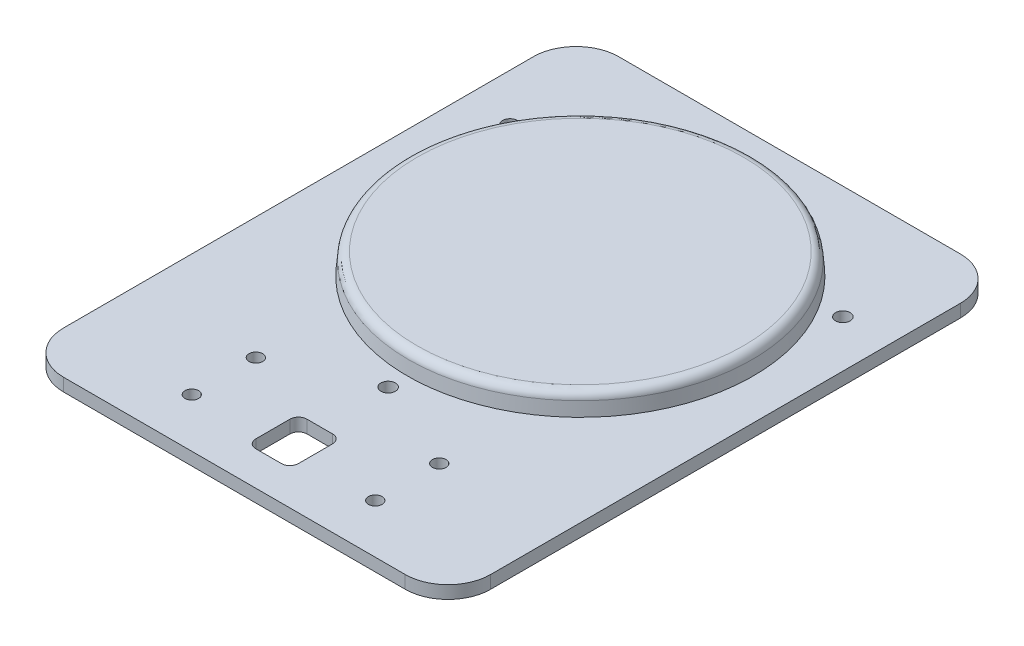
ISO-10303-21;
HEADER;
FILE_DESCRIPTION(('STEP AP214'),'2;1');
FILE_NAME('part.step','',(''),(''),'','','');
FILE_SCHEMA(('AUTOMOTIVE_DESIGN { 1 0 10303 214 1 1 1 1 }'));
ENDSEC;
DATA;
#1=APPLICATION_CONTEXT('core data for automotive mechanical design processes');
#2=APPLICATION_PROTOCOL_DEFINITION('international standard','automotive_design',2000,#1);
#3=PRODUCT_CONTEXT('',#1,'mechanical');
#4=PRODUCT('Part','Part','',(#3));
#5=PRODUCT_RELATED_PRODUCT_CATEGORY('part','',(#4));
#6=PRODUCT_DEFINITION_FORMATION('','',#4);
#7=PRODUCT_DEFINITION_CONTEXT('part definition',#1,'design');
#8=PRODUCT_DEFINITION('design','',#6,#7);
#9=PRODUCT_DEFINITION_SHAPE('','',#8);
#10=(LENGTH_UNIT() NAMED_UNIT(*) SI_UNIT(.MILLI.,.METRE.));
#11=(NAMED_UNIT(*) PLANE_ANGLE_UNIT() SI_UNIT($,.RADIAN.));
#12=(NAMED_UNIT(*) SI_UNIT($,.STERADIAN.) SOLID_ANGLE_UNIT());
#13=UNCERTAINTY_MEASURE_WITH_UNIT(LENGTH_MEASURE(1.E-05),#10,'distance_accuracy_value','');
#14=(GEOMETRIC_REPRESENTATION_CONTEXT(3) GLOBAL_UNCERTAINTY_ASSIGNED_CONTEXT((#13)) GLOBAL_UNIT_ASSIGNED_CONTEXT((#10,
#11,#12)) REPRESENTATION_CONTEXT('',''));
#15=CARTESIAN_POINT('',(0.,0.,0.));
#16=DIRECTION('',(0.,0.,1.));
#17=DIRECTION('',(1.,0.,0.));
#18=AXIS2_PLACEMENT_3D('',#15,#16,#17);
#19=CARTESIAN_POINT('',(-40.,-3.,-55.));
#20=DIRECTION('',(0.,1.,0.));
#21=DIRECTION('',(0.,0.,1.));
#22=AXIS2_PLACEMENT_3D('',#19,#20,#21);
#23=CYLINDRICAL_SURFACE('',#22,9.99999999999999);
#24=CARTESIAN_POINT('',(-40.,0.,-55.));
#25=DIRECTION('',(0.,1.,0.));
#26=DIRECTION('',(0.,0.,-1.));
#27=AXIS2_PLACEMENT_3D('',#24,#25,#26);
#28=CIRCLE('',#27,9.99999999999999);
#29=CARTESIAN_POINT('',(-39.9999999999999,0.,-65.));
#30=VERTEX_POINT('',#29);
#31=CARTESIAN_POINT('',(-50.,0.,-54.9999999999999));
#32=VERTEX_POINT('',#31);
#33=EDGE_CURVE('E257',#30,#32,#28,.T.);
#34=ORIENTED_EDGE('',*,*,#33,.F.);
#35=DIRECTION('',(0.,1.,0.));
#36=VECTOR('',#35,1.);
#37=CARTESIAN_POINT('',(-39.9999999999999,-3.,-65.));
#38=LINE('',#37,#36);
#39=CARTESIAN_POINT('',(-39.9999999999999,-3.,-65.));
#40=VERTEX_POINT('',#39);
#41=EDGE_CURVE('E308',#40,#30,#38,.T.);
#42=ORIENTED_EDGE('',*,*,#41,.F.);
#43=CARTESIAN_POINT('',(-40.,-3.,-55.));
#44=DIRECTION('',(0.,1.,0.));
#45=DIRECTION('',(0.,0.,-1.));
#46=AXIS2_PLACEMENT_3D('',#43,#44,#45);
#47=CIRCLE('',#46,9.99999999999999);
#48=CARTESIAN_POINT('',(-50.,-3.,-54.9999999999999));
#49=VERTEX_POINT('',#48);
#50=EDGE_CURVE('E260',#40,#49,#47,.T.);
#51=ORIENTED_EDGE('',*,*,#50,.T.);
#52=DIRECTION('',(0.,1.,0.));
#53=VECTOR('',#52,1.);
#54=CARTESIAN_POINT('',(-50.,-3.,-54.9999999999999));
#55=LINE('',#54,#53);
#56=EDGE_CURVE('E285',#49,#32,#55,.T.);
#57=ORIENTED_EDGE('',*,*,#56,.T.);
#58=EDGE_LOOP('',(#34,#42,#51,#57));
#59=FACE_BOUND('',#58,.T.);
#60=ADVANCED_FACE('F36',(#59),#23,.T.);
#61=CARTESIAN_POINT('',(39.9999999999999,-3.,-65.));
#62=DIRECTION('',(0.,0.,-1.));
#63=DIRECTION('',(-1.,0.,0.));
#64=AXIS2_PLACEMENT_3D('',#61,#62,#63);
#65=PLANE('',#64);
#66=DIRECTION('',(-1.,0.,0.));
#67=VECTOR('',#66,1.);
#68=CARTESIAN_POINT('',(39.9999999999999,0.,-65.));
#69=LINE('',#68,#67);
#70=CARTESIAN_POINT('',(39.9999999999999,0.,-65.));
#71=VERTEX_POINT('',#70);
#72=EDGE_CURVE('E264',#71,#30,#69,.T.);
#73=ORIENTED_EDGE('',*,*,#72,.F.);
#74=DIRECTION('',(0.,1.,0.));
#75=VECTOR('',#74,1.);
#76=CARTESIAN_POINT('',(39.9999999999999,-3.,-65.));
#77=LINE('',#76,#75);
#78=CARTESIAN_POINT('',(39.9999999999999,-3.,-65.));
#79=VERTEX_POINT('',#78);
#80=EDGE_CURVE('E311',#79,#71,#77,.T.);
#81=ORIENTED_EDGE('',*,*,#80,.F.);
#82=DIRECTION('',(-1.,0.,0.));
#83=VECTOR('',#82,1.);
#84=CARTESIAN_POINT('',(39.9999999999999,-3.,-65.));
#85=LINE('',#84,#83);
#86=EDGE_CURVE('E282',#79,#40,#85,.T.);
#87=ORIENTED_EDGE('',*,*,#86,.T.);
#88=ORIENTED_EDGE('',*,*,#41,.T.);
#89=EDGE_LOOP('',(#73,#81,#87,#88));
#90=FACE_BOUND('',#89,.T.);
#91=ADVANCED_FACE('F339',(#90),#65,.T.);
#92=CARTESIAN_POINT('',(40.,-3.,-55.));
#93=DIRECTION('',(0.,1.,0.));
#94=DIRECTION('',(0.,0.,1.));
#95=AXIS2_PLACEMENT_3D('',#92,#93,#94);
#96=CYLINDRICAL_SURFACE('',#95,9.99999999999999);
#97=CARTESIAN_POINT('',(40.,0.,-55.));
#98=DIRECTION('',(0.,1.,0.));
#99=DIRECTION('',(0.,0.,-1.));
#100=AXIS2_PLACEMENT_3D('',#97,#98,#99);
#101=CIRCLE('',#100,9.99999999999999);
#102=CARTESIAN_POINT('',(50.,0.,-54.9999999999999));
#103=VERTEX_POINT('',#102);
#104=EDGE_CURVE('E303',#103,#71,#101,.T.);
#105=ORIENTED_EDGE('',*,*,#104,.F.);
#106=DIRECTION('',(0.,1.,0.));
#107=VECTOR('',#106,1.);
#108=CARTESIAN_POINT('',(50.,-3.,-54.9999999999999));
#109=LINE('',#108,#107);
#110=CARTESIAN_POINT('',(50.,-3.,-54.9999999999999));
#111=VERTEX_POINT('',#110);
#112=EDGE_CURVE('E313',#111,#103,#109,.T.);
#113=ORIENTED_EDGE('',*,*,#112,.F.);
#114=CARTESIAN_POINT('',(40.,-3.,-55.));
#115=DIRECTION('',(0.,1.,0.));
#116=DIRECTION('',(0.,0.,-1.));
#117=AXIS2_PLACEMENT_3D('',#114,#115,#116);
#118=CIRCLE('',#117,9.99999999999999);
#119=EDGE_CURVE('E279',#111,#79,#118,.T.);
#120=ORIENTED_EDGE('',*,*,#119,.T.);
#121=ORIENTED_EDGE('',*,*,#80,.T.);
#122=EDGE_LOOP('',(#105,#113,#120,#121));
#123=FACE_BOUND('',#122,.T.);
#124=ADVANCED_FACE('F344',(#123),#96,.T.);
#125=CARTESIAN_POINT('',(50.,-3.,54.9999999999999));
#126=DIRECTION('',(1.,0.,0.));
#127=DIRECTION('',(0.,0.,-1.));
#128=AXIS2_PLACEMENT_3D('',#125,#126,#127);
#129=PLANE('',#128);
#130=DIRECTION('',(0.,0.,-1.));
#131=VECTOR('',#130,1.);
#132=CARTESIAN_POINT('',(50.,0.,54.9999999999999));
#133=LINE('',#132,#131);
#134=CARTESIAN_POINT('',(50.,0.,54.9999999999999));
#135=VERTEX_POINT('',#134);
#136=EDGE_CURVE('E300',#135,#103,#133,.T.);
#137=ORIENTED_EDGE('',*,*,#136,.F.);
#138=DIRECTION('',(0.,1.,0.));
#139=VECTOR('',#138,1.);
#140=CARTESIAN_POINT('',(50.,-3.,54.9999999999999));
#141=LINE('',#140,#139);
#142=CARTESIAN_POINT('',(50.,-3.,54.9999999999999));
#143=VERTEX_POINT('',#142);
#144=EDGE_CURVE('E315',#143,#135,#141,.T.);
#145=ORIENTED_EDGE('',*,*,#144,.F.);
#146=DIRECTION('',(0.,0.,-1.));
#147=VECTOR('',#146,1.);
#148=CARTESIAN_POINT('',(50.,-3.,54.9999999999999));
#149=LINE('',#148,#147);
#150=EDGE_CURVE('E276',#143,#111,#149,.T.);
#151=ORIENTED_EDGE('',*,*,#150,.T.);
#152=ORIENTED_EDGE('',*,*,#112,.T.);
#153=EDGE_LOOP('',(#137,#145,#151,#152));
#154=FACE_BOUND('',#153,.T.);
#155=ADVANCED_FACE('F364',(#154),#129,.T.);
#156=CARTESIAN_POINT('',(40.,-3.,55.));
#157=DIRECTION('',(0.,1.,0.));
#158=DIRECTION('',(0.,0.,1.));
#159=AXIS2_PLACEMENT_3D('',#156,#157,#158);
#160=CYLINDRICAL_SURFACE('',#159,9.99999999999999);
#161=CARTESIAN_POINT('',(40.,0.,55.));
#162=DIRECTION('',(0.,1.,0.));
#163=DIRECTION('',(0.,0.,-1.));
#164=AXIS2_PLACEMENT_3D('',#161,#162,#163);
#165=CIRCLE('',#164,9.99999999999999);
#166=CARTESIAN_POINT('',(39.9999999999999,0.,65.));
#167=VERTEX_POINT('',#166);
#168=EDGE_CURVE('E297',#167,#135,#165,.T.);
#169=ORIENTED_EDGE('',*,*,#168,.F.);
#170=DIRECTION('',(0.,1.,0.));
#171=VECTOR('',#170,1.);
#172=CARTESIAN_POINT('',(39.9999999999999,-3.,65.));
#173=LINE('',#172,#171);
#174=CARTESIAN_POINT('',(39.9999999999999,-3.,65.));
#175=VERTEX_POINT('',#174);
#176=EDGE_CURVE('E317',#175,#167,#173,.T.);
#177=ORIENTED_EDGE('',*,*,#176,.F.);
#178=CARTESIAN_POINT('',(40.,-3.,55.));
#179=DIRECTION('',(0.,1.,0.));
#180=DIRECTION('',(0.,0.,-1.));
#181=AXIS2_PLACEMENT_3D('',#178,#179,#180);
#182=CIRCLE('',#181,9.99999999999999);
#183=EDGE_CURVE('E273',#175,#143,#182,.T.);
#184=ORIENTED_EDGE('',*,*,#183,.T.);
#185=ORIENTED_EDGE('',*,*,#144,.T.);
#186=EDGE_LOOP('',(#169,#177,#184,#185));
#187=FACE_BOUND('',#186,.T.);
#188=ADVANCED_FACE('F360',(#187),#160,.T.);
#189=CARTESIAN_POINT('',(39.9999999999999,-3.,65.));
#190=DIRECTION('',(0.,0.,1.));
#191=DIRECTION('',(1.,0.,0.));
#192=AXIS2_PLACEMENT_3D('',#189,#190,#191);
#193=PLANE('',#192);
#194=DIRECTION('',(1.,0.,0.));
#195=VECTOR('',#194,1.);
#196=CARTESIAN_POINT('',(39.9999999999999,0.,65.));
#197=LINE('',#196,#195);
#198=CARTESIAN_POINT('',(-39.9999999999999,0.,65.));
#199=VERTEX_POINT('',#198);
#200=EDGE_CURVE('E294',#199,#167,#197,.T.);
#201=ORIENTED_EDGE('',*,*,#200,.F.);
#202=DIRECTION('',(0.,1.,0.));
#203=VECTOR('',#202,1.);
#204=CARTESIAN_POINT('',(-39.9999999999999,-3.,65.));
#205=LINE('',#204,#203);
#206=CARTESIAN_POINT('',(-39.9999999999999,-3.,65.));
#207=VERTEX_POINT('',#206);
#208=EDGE_CURVE('E319',#207,#199,#205,.T.);
#209=ORIENTED_EDGE('',*,*,#208,.F.);
#210=DIRECTION('',(1.,0.,0.));
#211=VECTOR('',#210,1.);
#212=CARTESIAN_POINT('',(39.9999999999999,-3.,65.));
#213=LINE('',#212,#211);
#214=EDGE_CURVE('E270',#207,#175,#213,.T.);
#215=ORIENTED_EDGE('',*,*,#214,.T.);
#216=ORIENTED_EDGE('',*,*,#176,.T.);
#217=EDGE_LOOP('',(#201,#209,#215,#216));
#218=FACE_BOUND('',#217,.T.);
#219=ADVANCED_FACE('F356',(#218),#193,.T.);
#220=CARTESIAN_POINT('',(-40.,-3.,55.));
#221=DIRECTION('',(0.,1.,0.));
#222=DIRECTION('',(0.,0.,1.));
#223=AXIS2_PLACEMENT_3D('',#220,#221,#222);
#224=CYLINDRICAL_SURFACE('',#223,9.99999999999999);
#225=CARTESIAN_POINT('',(-40.,0.,55.));
#226=DIRECTION('',(0.,1.,0.));
#227=DIRECTION('',(0.,0.,-1.));
#228=AXIS2_PLACEMENT_3D('',#225,#226,#227);
#229=CIRCLE('',#228,9.99999999999999);
#230=CARTESIAN_POINT('',(-50.,0.,54.9999999999999));
#231=VERTEX_POINT('',#230);
#232=EDGE_CURVE('E291',#231,#199,#229,.T.);
#233=ORIENTED_EDGE('',*,*,#232,.F.);
#234=DIRECTION('',(0.,1.,0.));
#235=VECTOR('',#234,1.);
#236=CARTESIAN_POINT('',(-50.,-3.,54.9999999999999));
#237=LINE('',#236,#235);
#238=CARTESIAN_POINT('',(-50.,-3.,54.9999999999999));
#239=VERTEX_POINT('',#238);
#240=EDGE_CURVE('E321',#239,#231,#237,.T.);
#241=ORIENTED_EDGE('',*,*,#240,.F.);
#242=CARTESIAN_POINT('',(-40.,-3.,55.));
#243=DIRECTION('',(0.,1.,0.));
#244=DIRECTION('',(0.,0.,-1.));
#245=AXIS2_PLACEMENT_3D('',#242,#243,#244);
#246=CIRCLE('',#245,9.99999999999999);
#247=EDGE_CURVE('E267',#239,#207,#246,.T.);
#248=ORIENTED_EDGE('',*,*,#247,.T.);
#249=ORIENTED_EDGE('',*,*,#208,.T.);
#250=EDGE_LOOP('',(#233,#241,#248,#249));
#251=FACE_BOUND('',#250,.T.);
#252=ADVANCED_FACE('F352',(#251),#224,.T.);
#253=CARTESIAN_POINT('',(-50.,-3.,54.9999999999999));
#254=DIRECTION('',(-1.,0.,0.));
#255=DIRECTION('',(0.,0.,1.));
#256=AXIS2_PLACEMENT_3D('',#253,#254,#255);
#257=PLANE('',#256);
#258=DIRECTION('',(0.,0.,1.));
#259=VECTOR('',#258,1.);
#260=CARTESIAN_POINT('',(-50.,0.,54.9999999999999));
#261=LINE('',#260,#259);
#262=EDGE_CURVE('E288',#32,#231,#261,.T.);
#263=ORIENTED_EDGE('',*,*,#262,.F.);
#264=ORIENTED_EDGE('',*,*,#56,.F.);
#265=DIRECTION('',(0.,0.,1.));
#266=VECTOR('',#265,1.);
#267=CARTESIAN_POINT('',(-50.,-3.,54.9999999999999));
#268=LINE('',#267,#266);
#269=EDGE_CURVE('E263',#49,#239,#268,.T.);
#270=ORIENTED_EDGE('',*,*,#269,.T.);
#271=ORIENTED_EDGE('',*,*,#240,.T.);
#272=EDGE_LOOP('',(#263,#264,#270,#271));
#273=FACE_BOUND('',#272,.T.);
#274=ADVANCED_FACE('F349',(#273),#257,.T.);
#275=CARTESIAN_POINT('',(-40.,-3.,-55.));
#276=DIRECTION('',(0.,-1.,0.));
#277=DIRECTION('',(0.,0.,-1.));
#278=AXIS2_PLACEMENT_3D('',#275,#276,#277);
#279=PLANE('',#278);
#280=CARTESIAN_POINT('',(3.00000000000002,-3.,55.0000000000001));
#281=DIRECTION('',(0.,1.,0.));
#282=DIRECTION('',(0.,0.,1.));
#283=AXIS2_PLACEMENT_3D('',#280,#281,#282);
#284=CIRCLE('',#283,2.);
#285=CARTESIAN_POINT('',(3.00000000000001,-3.,57.0000000000001));
#286=VERTEX_POINT('',#285);
#287=CARTESIAN_POINT('',(5.00000000000002,-3.,55.));
#288=VERTEX_POINT('',#287);
#289=EDGE_CURVE('E151',#286,#288,#284,.T.);
#290=ORIENTED_EDGE('',*,*,#289,.T.);
#291=DIRECTION('',(0.,0.,-1.));
#292=VECTOR('',#291,1.);
#293=CARTESIAN_POINT('',(5.00000000000002,-3.,55.));
#294=LINE('',#293,#292);
#295=CARTESIAN_POINT('',(5.00000000000002,-3.,47.0000000000001));
#296=VERTEX_POINT('',#295);
#297=EDGE_CURVE('E160',#288,#296,#294,.T.);
#298=ORIENTED_EDGE('',*,*,#297,.T.);
#299=CARTESIAN_POINT('',(3.00000000000002,-3.,47.0000000000001));
#300=DIRECTION('',(0.,1.,0.));
#301=DIRECTION('',(0.,0.,1.));
#302=AXIS2_PLACEMENT_3D('',#299,#300,#301);
#303=CIRCLE('',#302,2.);
#304=CARTESIAN_POINT('',(3.00000000000001,-3.,45.0000000000001));
#305=VERTEX_POINT('',#304);
#306=EDGE_CURVE('E51',#296,#305,#303,.T.);
#307=ORIENTED_EDGE('',*,*,#306,.T.);
#308=DIRECTION('',(-1.,0.,0.));
#309=VECTOR('',#308,1.);
#310=CARTESIAN_POINT('',(3.00000000000001,-3.,45.0000000000001));
#311=LINE('',#310,#309);
#312=CARTESIAN_POINT('',(-2.99999999999997,-3.,45.0000000000001));
#313=VERTEX_POINT('',#312);
#314=EDGE_CURVE('E175',#305,#313,#311,.T.);
#315=ORIENTED_EDGE('',*,*,#314,.T.);
#316=CARTESIAN_POINT('',(-2.99999999999998,-3.,47.0000000000001));
#317=DIRECTION('',(0.,1.,0.));
#318=DIRECTION('',(0.,0.,1.));
#319=AXIS2_PLACEMENT_3D('',#316,#317,#318);
#320=CIRCLE('',#319,2.);
#321=CARTESIAN_POINT('',(-4.99999999999998,-3.,47.0000000000001));
#322=VERTEX_POINT('',#321);
#323=EDGE_CURVE('E178',#313,#322,#320,.T.);
#324=ORIENTED_EDGE('',*,*,#323,.T.);
#325=DIRECTION('',(0.,0.,1.));
#326=VECTOR('',#325,1.);
#327=CARTESIAN_POINT('',(-4.99999999999998,-3.,55.));
#328=LINE('',#327,#326);
#329=CARTESIAN_POINT('',(-4.99999999999998,-3.,55.));
#330=VERTEX_POINT('',#329);
#331=EDGE_CURVE('E181',#322,#330,#328,.T.);
#332=ORIENTED_EDGE('',*,*,#331,.T.);
#333=CARTESIAN_POINT('',(-2.99999999999998,-3.,55.0000000000001));
#334=DIRECTION('',(0.,1.,0.));
#335=DIRECTION('',(0.,0.,1.));
#336=AXIS2_PLACEMENT_3D('',#333,#334,#335);
#337=CIRCLE('',#336,2.);
#338=CARTESIAN_POINT('',(-2.99999999999996,-3.,57.0000000000001));
#339=VERTEX_POINT('',#338);
#340=EDGE_CURVE('E184',#330,#339,#337,.T.);
#341=ORIENTED_EDGE('',*,*,#340,.T.);
#342=DIRECTION('',(1.,0.,0.));
#343=VECTOR('',#342,1.);
#344=CARTESIAN_POINT('',(3.00000000000001,-3.,57.0000000000001));
#345=LINE('',#344,#343);
#346=EDGE_CURVE('E157',#339,#286,#345,.T.);
#347=ORIENTED_EDGE('',*,*,#346,.T.);
#348=EDGE_LOOP('',(#290,#298,#307,#315,#324,#332,#341,#347));
#349=FACE_BOUND('',#348,.T.);
#350=CARTESIAN_POINT('',(38.9711431703,-3.,-38.4999999999996));
#351=DIRECTION('',(0.,1.,0.));
#352=DIRECTION('',(0.,0.,1.));
#353=AXIS2_PLACEMENT_3D('',#350,#351,#352);
#354=CIRCLE('',#353,1.69999999999999);
#355=CARTESIAN_POINT('',(38.9711431703,-3.,-36.7999999999996));
#356=VERTEX_POINT('',#355);
#357=EDGE_CURVE('E218',#356,#356,#354,.T.);
#358=ORIENTED_EDGE('',*,*,#357,.T.);
#359=EDGE_LOOP('',(#358));
#360=FACE_BOUND('',#359,.T.);
#361=CARTESIAN_POINT('',(-38.9711431702996,-3.,-38.5000000000002));
#362=DIRECTION('',(0.,1.,0.));
#363=DIRECTION('',(0.,0.,1.));
#364=AXIS2_PLACEMENT_3D('',#361,#362,#363);
#365=CIRCLE('',#364,1.7);
#366=CARTESIAN_POINT('',(-38.9711431702996,-3.,-36.8000000000002));
#367=VERTEX_POINT('',#366);
#368=EDGE_CURVE('E224',#367,#367,#365,.T.);
#369=ORIENTED_EDGE('',*,*,#368,.T.);
#370=EDGE_LOOP('',(#369));
#371=FACE_BOUND('',#370,.T.);
#372=CARTESIAN_POINT('',(0.,-3.,29.));
#373=DIRECTION('',(0.,1.,0.));
#374=DIRECTION('',(0.,0.,1.));
#375=AXIS2_PLACEMENT_3D('',#372,#373,#374);
#376=CIRCLE('',#375,1.7);
#377=CARTESIAN_POINT('',(0.,-3.,30.7));
#378=VERTEX_POINT('',#377);
#379=EDGE_CURVE('E230',#378,#378,#376,.T.);
#380=ORIENTED_EDGE('',*,*,#379,.T.);
#381=EDGE_LOOP('',(#380));
#382=FACE_BOUND('',#381,.T.);
#383=CARTESIAN_POINT('',(-21.475,-3.,53.5));
#384=DIRECTION('',(0.,1.,0.));
#385=DIRECTION('',(0.,0.,1.));
#386=AXIS2_PLACEMENT_3D('',#383,#384,#385);
#387=CIRCLE('',#386,1.60000000000001);
#388=CARTESIAN_POINT('',(-21.475,-3.,55.1));
#389=VERTEX_POINT('',#388);
#390=EDGE_CURVE('E236',#389,#389,#387,.T.);
#391=ORIENTED_EDGE('',*,*,#390,.T.);
#392=EDGE_LOOP('',(#391));
#393=FACE_BOUND('',#392,.T.);
#394=CARTESIAN_POINT('',(-21.475,-3.,38.5));
#395=DIRECTION('',(0.,1.,0.));
#396=DIRECTION('',(0.,0.,1.));
#397=AXIS2_PLACEMENT_3D('',#394,#395,#396);
#398=CIRCLE('',#397,1.60000000000001);
#399=CARTESIAN_POINT('',(-21.475,-3.,40.1));
#400=VERTEX_POINT('',#399);
#401=EDGE_CURVE('E242',#400,#400,#398,.T.);
#402=ORIENTED_EDGE('',*,*,#401,.T.);
#403=EDGE_LOOP('',(#402));
#404=FACE_BOUND('',#403,.T.);
#405=CARTESIAN_POINT('',(21.475,-3.,53.5));
#406=DIRECTION('',(0.,1.,0.));
#407=DIRECTION('',(0.,0.,1.));
#408=AXIS2_PLACEMENT_3D('',#405,#406,#407);
#409=CIRCLE('',#408,1.60000000000001);
#410=CARTESIAN_POINT('',(21.475,-3.,55.1));
#411=VERTEX_POINT('',#410);
#412=EDGE_CURVE('E248',#411,#411,#409,.T.);
#413=ORIENTED_EDGE('',*,*,#412,.T.);
#414=EDGE_LOOP('',(#413));
#415=FACE_BOUND('',#414,.T.);
#416=CARTESIAN_POINT('',(21.475,-3.,38.5));
#417=DIRECTION('',(0.,1.,0.));
#418=DIRECTION('',(0.,0.,1.));
#419=AXIS2_PLACEMENT_3D('',#416,#417,#418);
#420=CIRCLE('',#419,1.60000000000001);
#421=CARTESIAN_POINT('',(21.475,-3.,40.1));
#422=VERTEX_POINT('',#421);
#423=EDGE_CURVE('E254',#422,#422,#420,.T.);
#424=ORIENTED_EDGE('',*,*,#423,.T.);
#425=EDGE_LOOP('',(#424));
#426=FACE_BOUND('',#425,.T.);
#427=ORIENTED_EDGE('',*,*,#50,.F.);
#428=ORIENTED_EDGE('',*,*,#86,.F.);
#429=ORIENTED_EDGE('',*,*,#119,.F.);
#430=ORIENTED_EDGE('',*,*,#150,.F.);
#431=ORIENTED_EDGE('',*,*,#183,.F.);
#432=ORIENTED_EDGE('',*,*,#214,.F.);
#433=ORIENTED_EDGE('',*,*,#247,.F.);
#434=ORIENTED_EDGE('',*,*,#269,.F.);
#435=EDGE_LOOP('',(#427,#428,#429,#430,#431,#432,#433,#434));
#436=FACE_BOUND('',#435,.T.);
#437=ADVANCED_FACE('F164',(#349,#360,#371,#382,#393,#404,#415,#426,#436),#279,.T.);
#438=CARTESIAN_POINT('',(-40.,0.,-55.));
#439=DIRECTION('',(0.,-1.,0.));
#440=DIRECTION('',(0.,0.,-1.));
#441=AXIS2_PLACEMENT_3D('',#438,#439,#440);
#442=PLANE('',#441);
#443=CARTESIAN_POINT('',(0.,0.,-16.));
#444=DIRECTION('',(0.,-1.,0.));
#445=DIRECTION('',(0.,0.,-1.));
#446=AXIS2_PLACEMENT_3D('',#443,#444,#445);
#447=CIRCLE('',#446,40.5);
#448=CARTESIAN_POINT('',(0.,0.,-56.5));
#449=VERTEX_POINT('',#448);
#450=EDGE_CURVE('E310',#449,#449,#447,.F.);
#451=ORIENTED_EDGE('',*,*,#450,.F.);
#452=EDGE_LOOP('',(#451));
#453=FACE_BOUND('',#452,.T.);
#454=DIRECTION('',(0.,0.,-1.));
#455=VECTOR('',#454,1.);
#456=CARTESIAN_POINT('',(5.00000000000002,0.,55.));
#457=LINE('',#456,#455);
#458=CARTESIAN_POINT('',(5.00000000000002,0.,55.));
#459=VERTEX_POINT('',#458);
#460=CARTESIAN_POINT('',(5.00000000000002,0.,47.0000000000001));
#461=VERTEX_POINT('',#460);
#462=EDGE_CURVE('E188',#459,#461,#457,.T.);
#463=ORIENTED_EDGE('',*,*,#462,.F.);
#464=CARTESIAN_POINT('',(3.00000000000002,0.,55.0000000000001));
#465=DIRECTION('',(0.,1.,0.));
#466=DIRECTION('',(0.,0.,1.));
#467=AXIS2_PLACEMENT_3D('',#464,#465,#466);
#468=CIRCLE('',#467,2.);
#469=CARTESIAN_POINT('',(3.00000000000001,0.,57.0000000000001));
#470=VERTEX_POINT('',#469);
#471=EDGE_CURVE('E59',#470,#459,#468,.T.);
#472=ORIENTED_EDGE('',*,*,#471,.F.);
#473=DIRECTION('',(1.,0.,0.));
#474=VECTOR('',#473,1.);
#475=CARTESIAN_POINT('',(3.00000000000001,0.,57.0000000000001));
#476=LINE('',#475,#474);
#477=CARTESIAN_POINT('',(-2.99999999999996,0.,57.0000000000001));
#478=VERTEX_POINT('',#477);
#479=EDGE_CURVE('E168',#478,#470,#476,.T.);
#480=ORIENTED_EDGE('',*,*,#479,.F.);
#481=CARTESIAN_POINT('',(-2.99999999999998,0.,55.0000000000001));
#482=DIRECTION('',(0.,1.,0.));
#483=DIRECTION('',(0.,0.,1.));
#484=AXIS2_PLACEMENT_3D('',#481,#482,#483);
#485=CIRCLE('',#484,2.);
#486=CARTESIAN_POINT('',(-4.99999999999998,0.,55.));
#487=VERTEX_POINT('',#486);
#488=EDGE_CURVE('E171',#487,#478,#485,.T.);
#489=ORIENTED_EDGE('',*,*,#488,.F.);
#490=DIRECTION('',(0.,0.,1.));
#491=VECTOR('',#490,1.);
#492=CARTESIAN_POINT('',(-4.99999999999998,0.,55.));
#493=LINE('',#492,#491);
#494=CARTESIAN_POINT('',(-4.99999999999998,0.,47.0000000000001));
#495=VERTEX_POINT('',#494);
#496=EDGE_CURVE('E199',#495,#487,#493,.T.);
#497=ORIENTED_EDGE('',*,*,#496,.F.);
#498=CARTESIAN_POINT('',(-2.99999999999998,0.,47.0000000000001));
#499=DIRECTION('',(0.,1.,0.));
#500=DIRECTION('',(0.,0.,1.));
#501=AXIS2_PLACEMENT_3D('',#498,#499,#500);
#502=CIRCLE('',#501,2.);
#503=CARTESIAN_POINT('',(-2.99999999999997,0.,45.0000000000001));
#504=VERTEX_POINT('',#503);
#505=EDGE_CURVE('E196',#504,#495,#502,.T.);
#506=ORIENTED_EDGE('',*,*,#505,.F.);
#507=DIRECTION('',(-1.,0.,0.));
#508=VECTOR('',#507,1.);
#509=CARTESIAN_POINT('',(3.00000000000001,0.,45.0000000000001));
#510=LINE('',#509,#508);
#511=CARTESIAN_POINT('',(3.00000000000001,0.,45.0000000000001));
#512=VERTEX_POINT('',#511);
#513=EDGE_CURVE('E193',#512,#504,#510,.T.);
#514=ORIENTED_EDGE('',*,*,#513,.F.);
#515=CARTESIAN_POINT('',(3.00000000000002,0.,47.0000000000001));
#516=DIRECTION('',(0.,1.,0.));
#517=DIRECTION('',(0.,0.,1.));
#518=AXIS2_PLACEMENT_3D('',#515,#516,#517);
#519=CIRCLE('',#518,2.);
#520=EDGE_CURVE('E190',#461,#512,#519,.T.);
#521=ORIENTED_EDGE('',*,*,#520,.F.);
#522=EDGE_LOOP('',(#463,#472,#480,#489,#497,#506,#514,#521));
#523=FACE_BOUND('',#522,.T.);
#524=CARTESIAN_POINT('',(38.9711431703,0.,-38.4999999999996));
#525=DIRECTION('',(0.,1.,0.));
#526=DIRECTION('',(0.,0.,1.));
#527=AXIS2_PLACEMENT_3D('',#524,#525,#526);
#528=CIRCLE('',#527,1.69999999999999);
#529=CARTESIAN_POINT('',(38.9711431703,0.,-36.7999999999996));
#530=VERTEX_POINT('',#529);
#531=EDGE_CURVE('E206',#530,#530,#528,.T.);
#532=ORIENTED_EDGE('',*,*,#531,.F.);
#533=EDGE_LOOP('',(#532));
#534=FACE_BOUND('',#533,.T.);
#535=CARTESIAN_POINT('',(-38.9711431702996,0.,-38.5000000000002));
#536=DIRECTION('',(0.,1.,0.));
#537=DIRECTION('',(0.,0.,1.));
#538=AXIS2_PLACEMENT_3D('',#535,#536,#537);
#539=CIRCLE('',#538,1.7);
#540=CARTESIAN_POINT('',(-38.9711431702996,0.,-36.8000000000002));
#541=VERTEX_POINT('',#540);
#542=EDGE_CURVE('E221',#541,#541,#539,.T.);
#543=ORIENTED_EDGE('',*,*,#542,.F.);
#544=EDGE_LOOP('',(#543));
#545=FACE_BOUND('',#544,.T.);
#546=CARTESIAN_POINT('',(0.,0.,29.));
#547=DIRECTION('',(0.,1.,0.));
#548=DIRECTION('',(0.,0.,1.));
#549=AXIS2_PLACEMENT_3D('',#546,#547,#548);
#550=CIRCLE('',#549,1.7);
#551=CARTESIAN_POINT('',(0.,0.,30.7));
#552=VERTEX_POINT('',#551);
#553=EDGE_CURVE('E227',#552,#552,#550,.T.);
#554=ORIENTED_EDGE('',*,*,#553,.F.);
#555=EDGE_LOOP('',(#554));
#556=FACE_BOUND('',#555,.T.);
#557=CARTESIAN_POINT('',(-21.475,0.,53.5));
#558=DIRECTION('',(0.,1.,0.));
#559=DIRECTION('',(0.,0.,1.));
#560=AXIS2_PLACEMENT_3D('',#557,#558,#559);
#561=CIRCLE('',#560,1.60000000000001);
#562=CARTESIAN_POINT('',(-21.475,0.,55.1));
#563=VERTEX_POINT('',#562);
#564=EDGE_CURVE('E233',#563,#563,#561,.T.);
#565=ORIENTED_EDGE('',*,*,#564,.F.);
#566=EDGE_LOOP('',(#565));
#567=FACE_BOUND('',#566,.T.);
#568=CARTESIAN_POINT('',(-21.475,0.,38.5));
#569=DIRECTION('',(0.,1.,0.));
#570=DIRECTION('',(0.,0.,1.));
#571=AXIS2_PLACEMENT_3D('',#568,#569,#570);
#572=CIRCLE('',#571,1.60000000000001);
#573=CARTESIAN_POINT('',(-21.475,0.,40.1));
#574=VERTEX_POINT('',#573);
#575=EDGE_CURVE('E239',#574,#574,#572,.T.);
#576=ORIENTED_EDGE('',*,*,#575,.F.);
#577=EDGE_LOOP('',(#576));
#578=FACE_BOUND('',#577,.T.);
#579=CARTESIAN_POINT('',(21.475,0.,53.5));
#580=DIRECTION('',(0.,1.,0.));
#581=DIRECTION('',(0.,0.,1.));
#582=AXIS2_PLACEMENT_3D('',#579,#580,#581);
#583=CIRCLE('',#582,1.60000000000001);
#584=CARTESIAN_POINT('',(21.475,0.,55.1));
#585=VERTEX_POINT('',#584);
#586=EDGE_CURVE('E245',#585,#585,#583,.T.);
#587=ORIENTED_EDGE('',*,*,#586,.F.);
#588=EDGE_LOOP('',(#587));
#589=FACE_BOUND('',#588,.T.);
#590=CARTESIAN_POINT('',(21.475,0.,38.5));
#591=DIRECTION('',(0.,1.,0.));
#592=DIRECTION('',(0.,0.,1.));
#593=AXIS2_PLACEMENT_3D('',#590,#591,#592);
#594=CIRCLE('',#593,1.60000000000001);
#595=CARTESIAN_POINT('',(21.475,0.,40.1));
#596=VERTEX_POINT('',#595);
#597=EDGE_CURVE('E251',#596,#596,#594,.T.);
#598=ORIENTED_EDGE('',*,*,#597,.F.);
#599=EDGE_LOOP('',(#598));
#600=FACE_BOUND('',#599,.T.);
#601=ORIENTED_EDGE('',*,*,#33,.T.);
#602=ORIENTED_EDGE('',*,*,#262,.T.);
#603=ORIENTED_EDGE('',*,*,#232,.T.);
#604=ORIENTED_EDGE('',*,*,#200,.T.);
#605=ORIENTED_EDGE('',*,*,#168,.T.);
#606=ORIENTED_EDGE('',*,*,#136,.T.);
#607=ORIENTED_EDGE('',*,*,#104,.T.);
#608=ORIENTED_EDGE('',*,*,#72,.T.);
#609=EDGE_LOOP('',(#601,#602,#603,#604,#605,#606,#607,#608));
#610=FACE_BOUND('',#609,.T.);
#611=ADVANCED_FACE('F372',(#453,#523,#534,#545,#556,#567,#578,#589,#600,#610),#442,.F.);
#612=CARTESIAN_POINT('',(21.475,-3.,38.5));
#613=DIRECTION('',(0.,1.,0.));
#614=DIRECTION('',(0.,0.,1.));
#615=AXIS2_PLACEMENT_3D('',#612,#613,#614);
#616=CYLINDRICAL_SURFACE('',#615,1.60000000000001);
#617=ORIENTED_EDGE('',*,*,#423,.F.);
#618=EDGE_LOOP('',(#617));
#619=FACE_BOUND('',#618,.T.);
#620=ORIENTED_EDGE('',*,*,#597,.T.);
#621=EDGE_LOOP('',(#620));
#622=FACE_BOUND('',#621,.T.);
#623=ADVANCED_FACE('F375',(#619,#622),#616,.F.);
#624=CARTESIAN_POINT('',(21.475,-3.,53.5));
#625=DIRECTION('',(0.,1.,0.));
#626=DIRECTION('',(0.,0.,1.));
#627=AXIS2_PLACEMENT_3D('',#624,#625,#626);
#628=CYLINDRICAL_SURFACE('',#627,1.60000000000001);
#629=ORIENTED_EDGE('',*,*,#412,.F.);
#630=EDGE_LOOP('',(#629));
#631=FACE_BOUND('',#630,.T.);
#632=ORIENTED_EDGE('',*,*,#586,.T.);
#633=EDGE_LOOP('',(#632));
#634=FACE_BOUND('',#633,.T.);
#635=ADVANCED_FACE('F381',(#631,#634),#628,.F.);
#636=CARTESIAN_POINT('',(-21.475,-3.,38.5));
#637=DIRECTION('',(0.,1.,0.));
#638=DIRECTION('',(0.,0.,1.));
#639=AXIS2_PLACEMENT_3D('',#636,#637,#638);
#640=CYLINDRICAL_SURFACE('',#639,1.60000000000001);
#641=ORIENTED_EDGE('',*,*,#401,.F.);
#642=EDGE_LOOP('',(#641));
#643=FACE_BOUND('',#642,.T.);
#644=ORIENTED_EDGE('',*,*,#575,.T.);
#645=EDGE_LOOP('',(#644));
#646=FACE_BOUND('',#645,.T.);
#647=ADVANCED_FACE('F385',(#643,#646),#640,.F.);
#648=CARTESIAN_POINT('',(-21.475,-3.,53.5));
#649=DIRECTION('',(0.,1.,0.));
#650=DIRECTION('',(0.,0.,1.));
#651=AXIS2_PLACEMENT_3D('',#648,#649,#650);
#652=CYLINDRICAL_SURFACE('',#651,1.60000000000001);
#653=ORIENTED_EDGE('',*,*,#390,.F.);
#654=EDGE_LOOP('',(#653));
#655=FACE_BOUND('',#654,.T.);
#656=ORIENTED_EDGE('',*,*,#564,.T.);
#657=EDGE_LOOP('',(#656));
#658=FACE_BOUND('',#657,.T.);
#659=ADVANCED_FACE('F389',(#655,#658),#652,.F.);
#660=CARTESIAN_POINT('',(0.,-3.,29.));
#661=DIRECTION('',(0.,1.,0.));
#662=DIRECTION('',(0.,0.,1.));
#663=AXIS2_PLACEMENT_3D('',#660,#661,#662);
#664=CYLINDRICAL_SURFACE('',#663,1.7);
#665=ORIENTED_EDGE('',*,*,#379,.F.);
#666=EDGE_LOOP('',(#665));
#667=FACE_BOUND('',#666,.T.);
#668=ORIENTED_EDGE('',*,*,#553,.T.);
#669=EDGE_LOOP('',(#668));
#670=FACE_BOUND('',#669,.T.);
#671=ADVANCED_FACE('F393',(#667,#670),#664,.F.);
#672=CARTESIAN_POINT('',(-38.9711431702996,-3.,-38.5000000000002));
#673=DIRECTION('',(0.,1.,0.));
#674=DIRECTION('',(0.,0.,1.));
#675=AXIS2_PLACEMENT_3D('',#672,#673,#674);
#676=CYLINDRICAL_SURFACE('',#675,1.7);
#677=ORIENTED_EDGE('',*,*,#368,.F.);
#678=EDGE_LOOP('',(#677));
#679=FACE_BOUND('',#678,.T.);
#680=ORIENTED_EDGE('',*,*,#542,.T.);
#681=EDGE_LOOP('',(#680));
#682=FACE_BOUND('',#681,.T.);
#683=ADVANCED_FACE('F397',(#679,#682),#676,.F.);
#684=CARTESIAN_POINT('',(38.9711431703,-3.,-38.4999999999996));
#685=DIRECTION('',(0.,1.,0.));
#686=DIRECTION('',(0.,0.,1.));
#687=AXIS2_PLACEMENT_3D('',#684,#685,#686);
#688=CYLINDRICAL_SURFACE('',#687,1.69999999999999);
#689=ORIENTED_EDGE('',*,*,#357,.F.);
#690=EDGE_LOOP('',(#689));
#691=FACE_BOUND('',#690,.T.);
#692=ORIENTED_EDGE('',*,*,#531,.T.);
#693=EDGE_LOOP('',(#692));
#694=FACE_BOUND('',#693,.T.);
#695=ADVANCED_FACE('F401',(#691,#694),#688,.F.);
#696=CARTESIAN_POINT('',(3.00000000000002,-3.,55.0000000000001));
#697=DIRECTION('',(0.,1.,0.));
#698=DIRECTION('',(0.,0.,1.));
#699=AXIS2_PLACEMENT_3D('',#696,#697,#698);
#700=CYLINDRICAL_SURFACE('',#699,2.);
#701=ORIENTED_EDGE('',*,*,#471,.T.);
#702=DIRECTION('',(0.,1.,0.));
#703=VECTOR('',#702,1.);
#704=CARTESIAN_POINT('',(5.00000000000002,-3.,55.));
#705=LINE('',#704,#703);
#706=EDGE_CURVE('E147',#288,#459,#705,.T.);
#707=ORIENTED_EDGE('',*,*,#706,.F.);
#708=ORIENTED_EDGE('',*,*,#289,.F.);
#709=DIRECTION('',(0.,1.,0.));
#710=VECTOR('',#709,1.);
#711=CARTESIAN_POINT('',(3.00000000000001,-3.,57.0000000000001));
#712=LINE('',#711,#710);
#713=EDGE_CURVE('E204',#286,#470,#712,.T.);
#714=ORIENTED_EDGE('',*,*,#713,.T.);
#715=EDGE_LOOP('',(#701,#707,#708,#714));
#716=FACE_BOUND('',#715,.T.);
#717=ADVANCED_FACE('F149',(#716),#700,.F.);
#718=CARTESIAN_POINT('',(3.00000000000001,-3.,57.0000000000001));
#719=DIRECTION('',(0.,0.,1.));
#720=DIRECTION('',(1.,0.,0.));
#721=AXIS2_PLACEMENT_3D('',#718,#719,#720);
#722=PLANE('',#721);
#723=ORIENTED_EDGE('',*,*,#479,.T.);
#724=ORIENTED_EDGE('',*,*,#713,.F.);
#725=ORIENTED_EDGE('',*,*,#346,.F.);
#726=DIRECTION('',(0.,1.,0.));
#727=VECTOR('',#726,1.);
#728=CARTESIAN_POINT('',(-2.99999999999996,-3.,57.0000000000001));
#729=LINE('',#728,#727);
#730=EDGE_CURVE('E207',#339,#478,#729,.T.);
#731=ORIENTED_EDGE('',*,*,#730,.T.);
#732=EDGE_LOOP('',(#723,#724,#725,#731));
#733=FACE_BOUND('',#732,.T.);
#734=ADVANCED_FACE('F408',(#733),#722,.F.);
#735=CARTESIAN_POINT('',(-2.99999999999998,-3.,55.0000000000001));
#736=DIRECTION('',(0.,1.,0.));
#737=DIRECTION('',(0.,0.,1.));
#738=AXIS2_PLACEMENT_3D('',#735,#736,#737);
#739=CYLINDRICAL_SURFACE('',#738,2.);
#740=ORIENTED_EDGE('',*,*,#488,.T.);
#741=ORIENTED_EDGE('',*,*,#730,.F.);
#742=ORIENTED_EDGE('',*,*,#340,.F.);
#743=DIRECTION('',(0.,1.,0.));
#744=VECTOR('',#743,1.);
#745=CARTESIAN_POINT('',(-4.99999999999998,-3.,55.));
#746=LINE('',#745,#744);
#747=EDGE_CURVE('E209',#330,#487,#746,.T.);
#748=ORIENTED_EDGE('',*,*,#747,.T.);
#749=EDGE_LOOP('',(#740,#741,#742,#748));
#750=FACE_BOUND('',#749,.T.);
#751=ADVANCED_FACE('F425',(#750),#739,.F.);
#752=CARTESIAN_POINT('',(-4.99999999999998,-3.,55.));
#753=DIRECTION('',(-1.,0.,0.));
#754=DIRECTION('',(0.,0.,1.));
#755=AXIS2_PLACEMENT_3D('',#752,#753,#754);
#756=PLANE('',#755);
#757=ORIENTED_EDGE('',*,*,#496,.T.);
#758=ORIENTED_EDGE('',*,*,#747,.F.);
#759=ORIENTED_EDGE('',*,*,#331,.F.);
#760=DIRECTION('',(0.,1.,0.));
#761=VECTOR('',#760,1.);
#762=CARTESIAN_POINT('',(-4.99999999999998,-3.,47.0000000000001));
#763=LINE('',#762,#761);
#764=EDGE_CURVE('E211',#322,#495,#763,.T.);
#765=ORIENTED_EDGE('',*,*,#764,.T.);
#766=EDGE_LOOP('',(#757,#758,#759,#765));
#767=FACE_BOUND('',#766,.T.);
#768=ADVANCED_FACE('F421',(#767),#756,.F.);
#769=CARTESIAN_POINT('',(-2.99999999999998,-3.,47.0000000000001));
#770=DIRECTION('',(0.,1.,0.));
#771=DIRECTION('',(0.,0.,1.));
#772=AXIS2_PLACEMENT_3D('',#769,#770,#771);
#773=CYLINDRICAL_SURFACE('',#772,2.);
#774=ORIENTED_EDGE('',*,*,#505,.T.);
#775=ORIENTED_EDGE('',*,*,#764,.F.);
#776=ORIENTED_EDGE('',*,*,#323,.F.);
#777=DIRECTION('',(0.,1.,0.));
#778=VECTOR('',#777,1.);
#779=CARTESIAN_POINT('',(-2.99999999999997,-3.,45.0000000000001));
#780=LINE('',#779,#778);
#781=EDGE_CURVE('E213',#313,#504,#780,.T.);
#782=ORIENTED_EDGE('',*,*,#781,.T.);
#783=EDGE_LOOP('',(#774,#775,#776,#782));
#784=FACE_BOUND('',#783,.T.);
#785=ADVANCED_FACE('F417',(#784),#773,.F.);
#786=CARTESIAN_POINT('',(3.00000000000001,-3.,45.0000000000001));
#787=DIRECTION('',(0.,0.,-1.));
#788=DIRECTION('',(-1.,0.,0.));
#789=AXIS2_PLACEMENT_3D('',#786,#787,#788);
#790=PLANE('',#789);
#791=ORIENTED_EDGE('',*,*,#513,.T.);
#792=ORIENTED_EDGE('',*,*,#781,.F.);
#793=ORIENTED_EDGE('',*,*,#314,.F.);
#794=DIRECTION('',(0.,1.,0.));
#795=VECTOR('',#794,1.);
#796=CARTESIAN_POINT('',(3.00000000000001,-3.,45.0000000000001));
#797=LINE('',#796,#795);
#798=EDGE_CURVE('E215',#305,#512,#797,.T.);
#799=ORIENTED_EDGE('',*,*,#798,.T.);
#800=EDGE_LOOP('',(#791,#792,#793,#799));
#801=FACE_BOUND('',#800,.T.);
#802=ADVANCED_FACE('F414',(#801),#790,.F.);
#803=CARTESIAN_POINT('',(3.00000000000002,-3.,47.0000000000001));
#804=DIRECTION('',(0.,1.,0.));
#805=DIRECTION('',(0.,0.,1.));
#806=AXIS2_PLACEMENT_3D('',#803,#804,#805);
#807=CYLINDRICAL_SURFACE('',#806,2.);
#808=ORIENTED_EDGE('',*,*,#520,.T.);
#809=ORIENTED_EDGE('',*,*,#798,.F.);
#810=ORIENTED_EDGE('',*,*,#306,.F.);
#811=DIRECTION('',(0.,1.,0.));
#812=VECTOR('',#811,1.);
#813=CARTESIAN_POINT('',(5.00000000000002,-3.,47.0000000000001));
#814=LINE('',#813,#812);
#815=EDGE_CURVE('E156',#296,#461,#814,.T.);
#816=ORIENTED_EDGE('',*,*,#815,.T.);
#817=EDGE_LOOP('',(#808,#809,#810,#816));
#818=FACE_BOUND('',#817,.T.);
#819=ADVANCED_FACE('F411',(#818),#807,.F.);
#820=CARTESIAN_POINT('',(5.00000000000002,-3.,55.));
#821=DIRECTION('',(1.,0.,0.));
#822=DIRECTION('',(0.,0.,-1.));
#823=AXIS2_PLACEMENT_3D('',#820,#821,#822);
#824=PLANE('',#823);
#825=ORIENTED_EDGE('',*,*,#462,.T.);
#826=ORIENTED_EDGE('',*,*,#815,.F.);
#827=ORIENTED_EDGE('',*,*,#297,.F.);
#828=ORIENTED_EDGE('',*,*,#706,.T.);
#829=EDGE_LOOP('',(#825,#826,#827,#828));
#830=FACE_BOUND('',#829,.T.);
#831=ADVANCED_FACE('F161',(#830),#824,.F.);
#832=CARTESIAN_POINT('',(0.,0.,-16.));
#833=DIRECTION('',(0.,-1.,0.));
#834=DIRECTION('',(0.,0.,1.));
#835=AXIS2_PLACEMENT_3D('',#832,#833,#834);
#836=CONICAL_SURFACE('',#835,40.5,0.0872664625997167);
#837=CARTESIAN_POINT('',(0.,3.17431148549532,-16.));
#838=DIRECTION('',(0.,-1.,0.));
#839=DIRECTION('',(0.,0.,-1.));
#840=AXIS2_PLACEMENT_3D('',#837,#838,#839);
#841=CIRCLE('',#840,40.222283730519);
#842=CARTESIAN_POINT('',(0.,3.17431148549532,-56.222283730519));
#843=VERTEX_POINT('',#842);
#844=EDGE_CURVE('E11',#843,#843,#841,.T.);
#845=ORIENTED_EDGE('',*,*,#844,.T.);
#846=EDGE_LOOP('',(#845));
#847=FACE_BOUND('',#846,.T.);
#848=ORIENTED_EDGE('',*,*,#450,.T.);
#849=EDGE_LOOP('',(#848));
#850=FACE_BOUND('',#849,.T.);
#851=ADVANCED_FACE('F335',(#847,#850),#836,.T.);
#852=CARTESIAN_POINT('',(0.,5.,-16.));
#853=DIRECTION('',(0.,1.,0.));
#854=DIRECTION('',(0.,0.,1.));
#855=AXIS2_PLACEMENT_3D('',#852,#853,#854);
#856=PLANE('',#855);
#857=CARTESIAN_POINT('',(0.,5.,-16.));
#858=DIRECTION('',(0.,1.,0.));
#859=DIRECTION('',(0.,0.,1.));
#860=AXIS2_PLACEMENT_3D('',#857,#858,#859);
#861=CIRCLE('',#860,38.2298943343355);
#862=CARTESIAN_POINT('',(0.,5.,22.2298943343355));
#863=VERTEX_POINT('',#862);
#864=EDGE_CURVE('E44',#863,#863,#861,.T.);
#865=ORIENTED_EDGE('',*,*,#864,.T.);
#866=EDGE_LOOP('',(#865));
#867=FACE_BOUND('',#866,.T.);
#868=ADVANCED_FACE('F328',(#867),#856,.T.);
#869=CARTESIAN_POINT('',(0.,3.,-16.));
#870=DIRECTION('',(0.,1.,0.));
#871=DIRECTION('',(0.,0.,1.));
#872=AXIS2_PLACEMENT_3D('',#869,#870,#871);
#873=TOROIDAL_SURFACE('',#872,38.2298943343355,2.);
#874=ORIENTED_EDGE('',*,*,#844,.F.);
#875=EDGE_LOOP('',(#874));
#876=FACE_BOUND('',#875,.T.);
#877=ORIENTED_EDGE('',*,*,#864,.F.);
#878=EDGE_LOOP('',(#877));
#879=FACE_BOUND('',#878,.T.);
#880=ADVANCED_FACE('F38',(#876,#879),#873,.T.);
#881=CLOSED_SHELL('',(#60,#91,#124,#155,#188,#219,#252,#274,#437,#611,#623,#635,#647,#659,#671,
#683,#695,#717,#734,#751,#768,#785,#802,#819,#831,#851,#868,#880));
#882=MANIFOLD_SOLID_BREP('B2',#881);
#883=ADVANCED_BREP_SHAPE_REPRESENTATION('',(#18,#882),#14);
#884=SHAPE_DEFINITION_REPRESENTATION(#9,#883);
ENDSEC;
END-ISO-10303-21;
